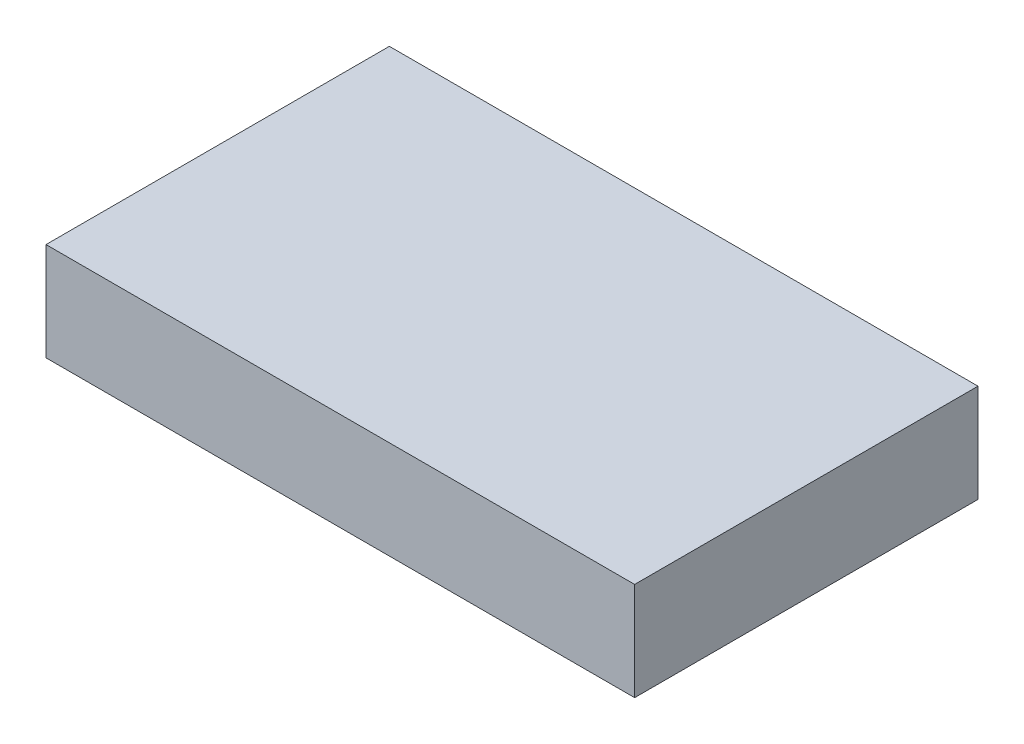
ISO-10303-21;
HEADER;
FILE_DESCRIPTION(('STEP AP214'),'2;1');
FILE_NAME('part.step','',(''),(''),'','','');
FILE_SCHEMA(('AUTOMOTIVE_DESIGN { 1 0 10303 214 1 1 1 1 }'));
ENDSEC;
DATA;
#1=APPLICATION_CONTEXT('core data for automotive mechanical design processes');
#2=APPLICATION_PROTOCOL_DEFINITION('international standard','automotive_design',2000,#1);
#3=PRODUCT_CONTEXT('',#1,'mechanical');
#4=PRODUCT('Part','Part','',(#3));
#5=PRODUCT_RELATED_PRODUCT_CATEGORY('part','',(#4));
#6=PRODUCT_DEFINITION_FORMATION('','',#4);
#7=PRODUCT_DEFINITION_CONTEXT('part definition',#1,'design');
#8=PRODUCT_DEFINITION('design','',#6,#7);
#9=PRODUCT_DEFINITION_SHAPE('','',#8);
#10=(LENGTH_UNIT() NAMED_UNIT(*) SI_UNIT(.MILLI.,.METRE.));
#11=(NAMED_UNIT(*) PLANE_ANGLE_UNIT() SI_UNIT($,.RADIAN.));
#12=(NAMED_UNIT(*) SI_UNIT($,.STERADIAN.) SOLID_ANGLE_UNIT());
#13=UNCERTAINTY_MEASURE_WITH_UNIT(LENGTH_MEASURE(1.E-05),#10,'distance_accuracy_value','');
#14=(GEOMETRIC_REPRESENTATION_CONTEXT(3) GLOBAL_UNCERTAINTY_ASSIGNED_CONTEXT((#13)) GLOBAL_UNIT_ASSIGNED_CONTEXT((#10,
#11,#12)) REPRESENTATION_CONTEXT('',''));
#15=CARTESIAN_POINT('',(0.,0.,0.));
#16=DIRECTION('',(0.,0.,1.));
#17=DIRECTION('',(1.,0.,0.));
#18=AXIS2_PLACEMENT_3D('',#15,#16,#17);
#19=CARTESIAN_POINT('',(0.,3.505,0.));
#20=DIRECTION('',(0.,-1.,0.));
#21=DIRECTION('',(0.,0.,-1.));
#22=AXIS2_PLACEMENT_3D('',#19,#20,#21);
#23=PLANE('',#22);
#24=DIRECTION('',(-1.,0.,0.));
#25=VECTOR('',#24,1.);
#26=CARTESIAN_POINT('',(0.,3.505,-1.99999999999993));
#27=LINE('',#26,#25);
#28=CARTESIAN_POINT('',(-9.9,3.505,-1.99999999999993));
#29=VERTEX_POINT('',#28);
#30=CARTESIAN_POINT('',(-11.1,3.505,-1.99999999999993));
#31=VERTEX_POINT('',#30);
#32=EDGE_CURVE('E11',#29,#31,#27,.T.);
#33=ORIENTED_EDGE('',*,*,#32,.F.);
#34=DIRECTION('',(0.,0.,1.));
#35=VECTOR('',#34,1.);
#36=CARTESIAN_POINT('',(-9.9,3.505,0.));
#37=LINE('',#36,#35);
#38=CARTESIAN_POINT('',(-9.9,3.505,-2.7));
#39=VERTEX_POINT('',#38);
#40=EDGE_CURVE('E24',#39,#29,#37,.T.);
#41=ORIENTED_EDGE('',*,*,#40,.F.);
#42=DIRECTION('',(1.,0.,0.));
#43=VECTOR('',#42,1.);
#44=CARTESIAN_POINT('',(0.,3.505,-2.7));
#45=LINE('',#44,#43);
#46=CARTESIAN_POINT('',(-11.1,3.505,-2.7));
#47=VERTEX_POINT('',#46);
#48=EDGE_CURVE('E60',#47,#39,#45,.T.);
#49=ORIENTED_EDGE('',*,*,#48,.F.);
#50=DIRECTION('',(0.,0.,-1.));
#51=VECTOR('',#50,1.);
#52=CARTESIAN_POINT('',(-11.1,3.505,0.));
#53=LINE('',#52,#51);
#54=EDGE_CURVE('E85',#31,#47,#53,.T.);
#55=ORIENTED_EDGE('',*,*,#54,.F.);
#56=EDGE_LOOP('',(#33,#41,#49,#55));
#57=FACE_BOUND('',#56,.T.);
#58=ADVANCED_FACE('F17',(#57),#23,.F.);
#59=CARTESIAN_POINT('',(-11.1,3.505,-1.99999999999993));
#60=DIRECTION('',(1.,0.,0.));
#61=DIRECTION('',(0.,0.,1.));
#62=AXIS2_PLACEMENT_3D('',#59,#60,#61);
#63=PLANE('',#62);
#64=DIRECTION('',(0.,-1.,0.));
#65=VECTOR('',#64,1.);
#66=CARTESIAN_POINT('',(-11.1,3.505,-1.99999999999993));
#67=LINE('',#66,#65);
#68=CARTESIAN_POINT('',(-11.1,3.305,-1.99999999999993));
#69=VERTEX_POINT('',#68);
#70=EDGE_CURVE('E83',#31,#69,#67,.T.);
#71=ORIENTED_EDGE('',*,*,#70,.F.);
#72=ORIENTED_EDGE('',*,*,#54,.T.);
#73=DIRECTION('',(0.,1.,0.));
#74=VECTOR('',#73,1.);
#75=CARTESIAN_POINT('',(-11.1,3.505,-2.7));
#76=LINE('',#75,#74);
#77=CARTESIAN_POINT('',(-11.1,3.305,-2.7));
#78=VERTEX_POINT('',#77);
#79=EDGE_CURVE('E81',#78,#47,#76,.T.);
#80=ORIENTED_EDGE('',*,*,#79,.F.);
#81=DIRECTION('',(0.,0.,-1.));
#82=VECTOR('',#81,1.);
#83=CARTESIAN_POINT('',(-11.1,3.305,-1.99999999999993));
#84=LINE('',#83,#82);
#85=EDGE_CURVE('E75',#69,#78,#84,.T.);
#86=ORIENTED_EDGE('',*,*,#85,.F.);
#87=EDGE_LOOP('',(#71,#72,#80,#86));
#88=FACE_BOUND('',#87,.T.);
#89=ADVANCED_FACE('F91',(#88),#63,.F.);
#90=CARTESIAN_POINT('',(-11.1,3.505,-1.99999999999993));
#91=DIRECTION('',(0.,0.,-1.));
#92=DIRECTION('',(0.,-1.,0.));
#93=AXIS2_PLACEMENT_3D('',#90,#91,#92);
#94=PLANE('',#93);
#95=DIRECTION('',(0.,-1.,0.));
#96=VECTOR('',#95,1.);
#97=CARTESIAN_POINT('',(-9.9,3.505,-1.99999999999993));
#98=LINE('',#97,#96);
#99=CARTESIAN_POINT('',(-9.9,3.305,-1.99999999999993));
#100=VERTEX_POINT('',#99);
#101=EDGE_CURVE('E67',#29,#100,#98,.T.);
#102=ORIENTED_EDGE('',*,*,#101,.F.);
#103=ORIENTED_EDGE('',*,*,#32,.T.);
#104=ORIENTED_EDGE('',*,*,#70,.T.);
#105=DIRECTION('',(-1.,0.,0.));
#106=VECTOR('',#105,1.);
#107=CARTESIAN_POINT('',(-11.1,3.305,-1.99999999999993));
#108=LINE('',#107,#106);
#109=EDGE_CURVE('E62',#100,#69,#108,.T.);
#110=ORIENTED_EDGE('',*,*,#109,.F.);
#111=EDGE_LOOP('',(#102,#103,#104,#110));
#112=FACE_BOUND('',#111,.T.);
#113=ADVANCED_FACE('F88',(#112),#94,.F.);
#114=CARTESIAN_POINT('',(-9.9,3.505,-1.99999999999993));
#115=DIRECTION('',(-1.,0.,0.));
#116=DIRECTION('',(0.,1.,0.));
#117=AXIS2_PLACEMENT_3D('',#114,#115,#116);
#118=PLANE('',#117);
#119=DIRECTION('',(0.,-1.,0.));
#120=VECTOR('',#119,1.);
#121=CARTESIAN_POINT('',(-9.9,3.505,-2.7));
#122=LINE('',#121,#120);
#123=CARTESIAN_POINT('',(-9.9,3.305,-2.7));
#124=VERTEX_POINT('',#123);
#125=EDGE_CURVE('E54',#39,#124,#122,.T.);
#126=ORIENTED_EDGE('',*,*,#125,.F.);
#127=ORIENTED_EDGE('',*,*,#40,.T.);
#128=ORIENTED_EDGE('',*,*,#101,.T.);
#129=DIRECTION('',(0.,0.,1.));
#130=VECTOR('',#129,1.);
#131=CARTESIAN_POINT('',(-9.9,3.305,-1.99999999999993));
#132=LINE('',#131,#130);
#133=EDGE_CURVE('E63',#124,#100,#132,.T.);
#134=ORIENTED_EDGE('',*,*,#133,.F.);
#135=EDGE_LOOP('',(#126,#127,#128,#134));
#136=FACE_BOUND('',#135,.T.);
#137=ADVANCED_FACE('F66',(#136),#118,.F.);
#138=CARTESIAN_POINT('',(-11.1,3.505,-2.7));
#139=DIRECTION('',(0.,0.,1.));
#140=DIRECTION('',(1.,0.,0.));
#141=AXIS2_PLACEMENT_3D('',#138,#139,#140);
#142=PLANE('',#141);
#143=ORIENTED_EDGE('',*,*,#79,.T.);
#144=ORIENTED_EDGE('',*,*,#48,.T.);
#145=ORIENTED_EDGE('',*,*,#125,.T.);
#146=DIRECTION('',(1.,0.,0.));
#147=VECTOR('',#146,1.);
#148=CARTESIAN_POINT('',(-11.1,3.305,-2.7));
#149=LINE('',#148,#147);
#150=EDGE_CURVE('E59',#78,#124,#149,.T.);
#151=ORIENTED_EDGE('',*,*,#150,.F.);
#152=EDGE_LOOP('',(#143,#144,#145,#151));
#153=FACE_BOUND('',#152,.T.);
#154=ADVANCED_FACE('F57',(#153),#142,.F.);
#155=CARTESIAN_POINT('',(0.,3.305,0.));
#156=DIRECTION('',(0.,-1.,0.));
#157=DIRECTION('',(0.,0.,-1.));
#158=AXIS2_PLACEMENT_3D('',#155,#156,#157);
#159=PLANE('',#158);
#160=ORIENTED_EDGE('',*,*,#133,.T.);
#161=ORIENTED_EDGE('',*,*,#109,.T.);
#162=ORIENTED_EDGE('',*,*,#85,.T.);
#163=ORIENTED_EDGE('',*,*,#150,.T.);
#164=EDGE_LOOP('',(#160,#161,#162,#163));
#165=FACE_BOUND('',#164,.T.);
#166=ADVANCED_FACE('F73',(#165),#159,.T.);
#167=CLOSED_SHELL('',(#58,#89,#113,#137,#154,#166));
#168=MANIFOLD_SOLID_BREP('B1',#167);
#169=ADVANCED_BREP_SHAPE_REPRESENTATION('',(#18,#168),#14);
#170=SHAPE_DEFINITION_REPRESENTATION(#9,#169);
ENDSEC;
END-ISO-10303-21;
